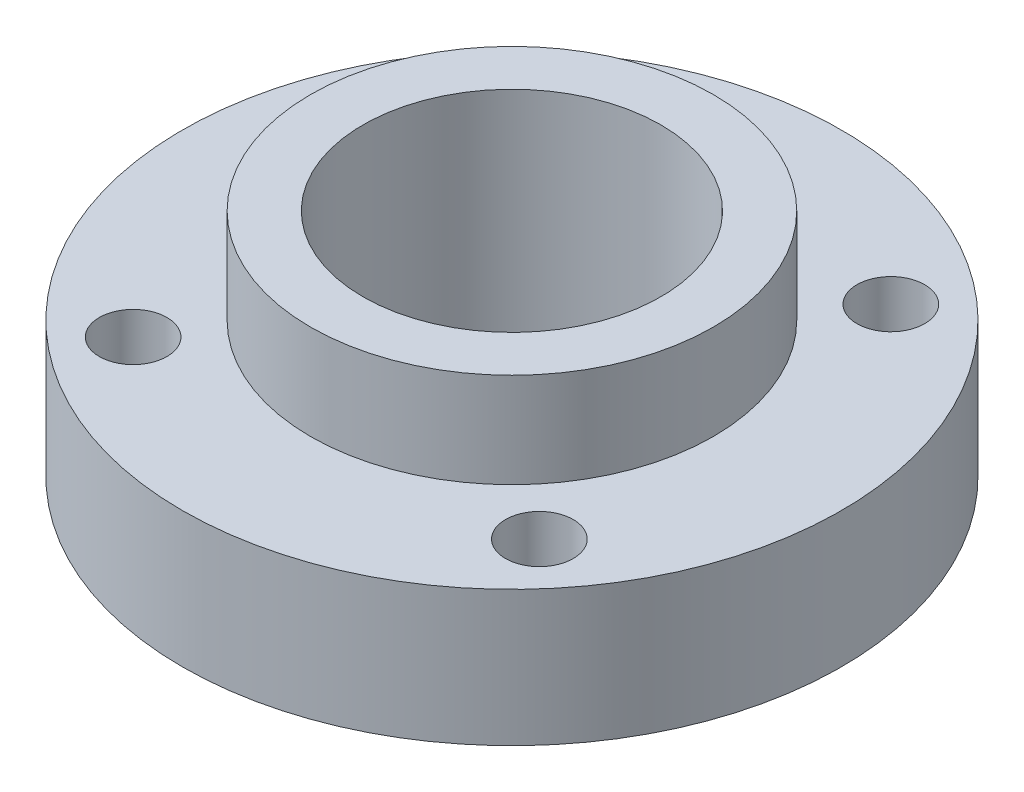
ISO-10303-21;
HEADER;
FILE_DESCRIPTION(('STEP AP214'),'2;1');
FILE_NAME('part.step','',(''),(''),'','','');
FILE_SCHEMA(('AUTOMOTIVE_DESIGN { 1 0 10303 214 1 1 1 1 }'));
ENDSEC;
DATA;
#1=APPLICATION_CONTEXT('core data for automotive mechanical design processes');
#2=APPLICATION_PROTOCOL_DEFINITION('international standard','automotive_design',2000,#1);
#3=PRODUCT_CONTEXT('',#1,'mechanical');
#4=PRODUCT('Part','Part','',(#3));
#5=PRODUCT_RELATED_PRODUCT_CATEGORY('part','',(#4));
#6=PRODUCT_DEFINITION_FORMATION('','',#4);
#7=PRODUCT_DEFINITION_CONTEXT('part definition',#1,'design');
#8=PRODUCT_DEFINITION('design','',#6,#7);
#9=PRODUCT_DEFINITION_SHAPE('','',#8);
#10=(LENGTH_UNIT() NAMED_UNIT(*) SI_UNIT(.MILLI.,.METRE.));
#11=(NAMED_UNIT(*) PLANE_ANGLE_UNIT() SI_UNIT($,.RADIAN.));
#12=(NAMED_UNIT(*) SI_UNIT($,.STERADIAN.) SOLID_ANGLE_UNIT());
#13=UNCERTAINTY_MEASURE_WITH_UNIT(LENGTH_MEASURE(1.E-05),#10,'distance_accuracy_value','');
#14=(GEOMETRIC_REPRESENTATION_CONTEXT(3) GLOBAL_UNCERTAINTY_ASSIGNED_CONTEXT((#13)) GLOBAL_UNIT_ASSIGNED_CONTEXT((#10,
#11,#12)) REPRESENTATION_CONTEXT('',''));
#15=CARTESIAN_POINT('',(0.,0.,0.));
#16=DIRECTION('',(0.,0.,1.));
#17=DIRECTION('',(1.,0.,0.));
#18=AXIS2_PLACEMENT_3D('',#15,#16,#17);
#19=CARTESIAN_POINT('',(-14.907558872272,17.,-21.3800407627514));
#20=DIRECTION('',(0.,-1.,0.));
#21=DIRECTION('',(0.,0.,-1.));
#22=AXIS2_PLACEMENT_3D('',#19,#20,#21);
#23=CYLINDRICAL_SURFACE('',#22,11.);
#24=CARTESIAN_POINT('',(-14.907558872272,1.,-21.3800407627514));
#25=DIRECTION('',(0.,1.,0.));
#26=DIRECTION('',(0.,0.,1.));
#27=AXIS2_PLACEMENT_3D('',#24,#25,#26);
#28=CIRCLE('',#27,11.);
#29=CARTESIAN_POINT('',(-14.907558872272,1.,-10.3800407627514));
#30=VERTEX_POINT('',#29);
#31=EDGE_CURVE('E10',#30,#30,#28,.T.);
#32=ORIENTED_EDGE('',*,*,#31,.F.);
#33=EDGE_LOOP('',(#32));
#34=FACE_BOUND('',#33,.T.);
#35=CARTESIAN_POINT('',(-14.907558872272,17.,-21.3800407627514));
#36=DIRECTION('',(0.,1.,0.));
#37=DIRECTION('',(0.,0.,1.));
#38=AXIS2_PLACEMENT_3D('',#35,#36,#37);
#39=CIRCLE('',#38,11.);
#40=CARTESIAN_POINT('',(-14.907558872272,17.,-10.3800407627514));
#41=VERTEX_POINT('',#40);
#42=EDGE_CURVE('E57',#41,#41,#39,.T.);
#43=ORIENTED_EDGE('',*,*,#42,.T.);
#44=EDGE_LOOP('',(#43));
#45=FACE_BOUND('',#44,.T.);
#46=ADVANCED_FACE('F45',(#34,#45),#23,.F.);
#47=CARTESIAN_POINT('',(-14.907558872272,17.,-21.3800407627514));
#48=DIRECTION('',(0.,-1.,0.));
#49=DIRECTION('',(0.,0.,-1.));
#50=AXIS2_PLACEMENT_3D('',#47,#48,#49);
#51=CYLINDRICAL_SURFACE('',#50,14.875);
#52=CARTESIAN_POINT('',(-14.907558872272,10.,-21.3800407627514));
#53=DIRECTION('',(0.,1.,0.));
#54=DIRECTION('',(0.,0.,1.));
#55=AXIS2_PLACEMENT_3D('',#52,#53,#54);
#56=CIRCLE('',#55,14.875);
#57=CARTESIAN_POINT('',(-14.907558872272,10.,-6.50504076275143));
#58=VERTEX_POINT('',#57);
#59=EDGE_CURVE('E69',#58,#58,#56,.T.);
#60=ORIENTED_EDGE('',*,*,#59,.T.);
#61=EDGE_LOOP('',(#60));
#62=FACE_BOUND('',#61,.T.);
#63=CARTESIAN_POINT('',(-14.907558872272,17.,-21.3800407627514));
#64=DIRECTION('',(0.,1.,0.));
#65=DIRECTION('',(0.,0.,1.));
#66=AXIS2_PLACEMENT_3D('',#63,#64,#65);
#67=CIRCLE('',#66,14.875);
#68=CARTESIAN_POINT('',(-14.907558872272,17.,-6.50504076275143));
#69=VERTEX_POINT('',#68);
#70=EDGE_CURVE('E52',#69,#69,#67,.T.);
#71=ORIENTED_EDGE('',*,*,#70,.F.);
#72=EDGE_LOOP('',(#71));
#73=FACE_BOUND('',#72,.T.);
#74=ADVANCED_FACE('F129',(#62,#73),#51,.T.);
#75=CARTESIAN_POINT('',(0.,17.,0.));
#76=DIRECTION('',(0.,1.,0.));
#77=DIRECTION('',(0.,0.,1.));
#78=AXIS2_PLACEMENT_3D('',#75,#76,#77);
#79=PLANE('',#78);
#80=ORIENTED_EDGE('',*,*,#42,.F.);
#81=EDGE_LOOP('',(#80));
#82=FACE_BOUND('',#81,.T.);
#83=ORIENTED_EDGE('',*,*,#70,.T.);
#84=EDGE_LOOP('',(#83));
#85=FACE_BOUND('',#84,.T.);
#86=ADVANCED_FACE('F134',(#82,#85),#79,.T.);
#87=CARTESIAN_POINT('',(0.,0.,0.));
#88=DIRECTION('',(0.,1.,0.));
#89=DIRECTION('',(0.,0.,1.));
#90=AXIS2_PLACEMENT_3D('',#87,#88,#89);
#91=PLANE('',#90);
#92=CARTESIAN_POINT('',(0.0980108130638321,0.,-8.40088522710385));
#93=DIRECTION('',(0.,1.,0.));
#94=DIRECTION('',(0.,0.,1.));
#95=AXIS2_PLACEMENT_3D('',#92,#93,#94);
#96=CIRCLE('',#95,2.5);
#97=CARTESIAN_POINT('',(0.0980108130638321,0.,-5.90088522710385));
#98=VERTEX_POINT('',#97);
#99=EDGE_CURVE('E82',#98,#98,#96,.T.);
#100=ORIENTED_EDGE('',*,*,#99,.T.);
#101=EDGE_LOOP('',(#100));
#102=FACE_BOUND('',#101,.T.);
#103=CARTESIAN_POINT('',(-1.94608397248787,0.,-36.4008852271039));
#104=DIRECTION('',(0.,1.,0.));
#105=DIRECTION('',(0.,0.,1.));
#106=AXIS2_PLACEMENT_3D('',#103,#104,#105);
#107=CIRCLE('',#106,2.5);
#108=CARTESIAN_POINT('',(-1.94608397248787,0.,-33.9008852271039));
#109=VERTEX_POINT('',#108);
#110=EDGE_CURVE('E78',#109,#109,#107,.T.);
#111=ORIENTED_EDGE('',*,*,#110,.T.);
#112=EDGE_LOOP('',(#111));
#113=FACE_BOUND('',#112,.T.);
#114=CARTESIAN_POINT('',(-27.8246335332248,0.,-6.32099755930153));
#115=DIRECTION('',(0.,1.,0.));
#116=DIRECTION('',(0.,0.,1.));
#117=AXIS2_PLACEMENT_3D('',#114,#115,#116);
#118=CIRCLE('',#117,2.49999999999999);
#119=CARTESIAN_POINT('',(-27.8246335332248,0.,-3.82099755930154));
#120=VERTEX_POINT('',#119);
#121=EDGE_CURVE('E74',#120,#120,#118,.T.);
#122=ORIENTED_EDGE('',*,*,#121,.T.);
#123=EDGE_LOOP('',(#122));
#124=FACE_BOUND('',#123,.T.);
#125=CARTESIAN_POINT('',(-29.9460839724879,0.,-34.3209975593015));
#126=DIRECTION('',(0.,1.,0.));
#127=DIRECTION('',(0.,0.,1.));
#128=AXIS2_PLACEMENT_3D('',#125,#126,#127);
#129=CIRCLE('',#128,2.5);
#130=CARTESIAN_POINT('',(-29.9460839724879,0.,-31.8209975593015));
#131=VERTEX_POINT('',#130);
#132=EDGE_CURVE('E70',#131,#131,#129,.T.);
#133=ORIENTED_EDGE('',*,*,#132,.T.);
#134=EDGE_LOOP('',(#133));
#135=FACE_BOUND('',#134,.T.);
#136=CARTESIAN_POINT('',(-14.907558872272,0.,-21.3800407627514));
#137=DIRECTION('',(0.,1.,0.));
#138=DIRECTION('',(0.,0.,1.));
#139=AXIS2_PLACEMENT_3D('',#136,#137,#138);
#140=CIRCLE('',#139,24.34);
#141=CARTESIAN_POINT('',(-14.907558872272,0.,2.95995923724857));
#142=VERTEX_POINT('',#141);
#143=EDGE_CURVE('E65',#142,#142,#140,.T.);
#144=ORIENTED_EDGE('',*,*,#143,.F.);
#145=EDGE_LOOP('',(#144));
#146=FACE_BOUND('',#145,.T.);
#147=CARTESIAN_POINT('',(-14.907558872272,0.,-21.3800407627514));
#148=DIRECTION('',(0.,1.,0.));
#149=DIRECTION('',(0.,0.,1.));
#150=AXIS2_PLACEMENT_3D('',#147,#148,#149);
#151=CIRCLE('',#150,7.375);
#152=CARTESIAN_POINT('',(-14.907558872272,0.,-14.0050407627514));
#153=VERTEX_POINT('',#152);
#154=EDGE_CURVE('E109',#153,#153,#151,.T.);
#155=ORIENTED_EDGE('',*,*,#154,.T.);
#156=EDGE_LOOP('',(#155));
#157=FACE_BOUND('',#156,.T.);
#158=ADVANCED_FACE('F140',(#102,#113,#124,#135,#146,#157),#91,.F.);
#159=CARTESIAN_POINT('',(-29.9460839724879,10.,-34.3209975593015));
#160=DIRECTION('',(0.,-1.,0.));
#161=DIRECTION('',(0.,0.,-1.));
#162=AXIS2_PLACEMENT_3D('',#159,#160,#161);
#163=CYLINDRICAL_SURFACE('',#162,2.5);
#164=CARTESIAN_POINT('',(-29.9460839724879,10.,-34.3209975593015));
#165=DIRECTION('',(0.,1.,0.));
#166=DIRECTION('',(0.,0.,1.));
#167=AXIS2_PLACEMENT_3D('',#164,#165,#166);
#168=CIRCLE('',#167,2.5);
#169=CARTESIAN_POINT('',(-29.9460839724879,10.,-31.8209975593015));
#170=VERTEX_POINT('',#169);
#171=EDGE_CURVE('E90',#170,#170,#168,.T.);
#172=ORIENTED_EDGE('',*,*,#171,.T.);
#173=EDGE_LOOP('',(#172));
#174=FACE_BOUND('',#173,.T.);
#175=ORIENTED_EDGE('',*,*,#132,.F.);
#176=EDGE_LOOP('',(#175));
#177=FACE_BOUND('',#176,.T.);
#178=ADVANCED_FACE('F145',(#174,#177),#163,.F.);
#179=CARTESIAN_POINT('',(-27.8246335332248,10.,-6.32099755930153));
#180=DIRECTION('',(0.,-1.,0.));
#181=DIRECTION('',(0.,0.,-1.));
#182=AXIS2_PLACEMENT_3D('',#179,#180,#181);
#183=CYLINDRICAL_SURFACE('',#182,2.49999999999999);
#184=CARTESIAN_POINT('',(-27.8246335332248,10.,-6.32099755930153));
#185=DIRECTION('',(0.,1.,0.));
#186=DIRECTION('',(0.,0.,1.));
#187=AXIS2_PLACEMENT_3D('',#184,#185,#186);
#188=CIRCLE('',#187,2.49999999999999);
#189=CARTESIAN_POINT('',(-27.8246335332248,10.,-3.82099755930154));
#190=VERTEX_POINT('',#189);
#191=EDGE_CURVE('E94',#190,#190,#188,.T.);
#192=ORIENTED_EDGE('',*,*,#191,.T.);
#193=EDGE_LOOP('',(#192));
#194=FACE_BOUND('',#193,.T.);
#195=ORIENTED_EDGE('',*,*,#121,.F.);
#196=EDGE_LOOP('',(#195));
#197=FACE_BOUND('',#196,.T.);
#198=ADVANCED_FACE('F157',(#194,#197),#183,.F.);
#199=CARTESIAN_POINT('',(-1.94608397248787,10.,-36.4008852271039));
#200=DIRECTION('',(0.,-1.,0.));
#201=DIRECTION('',(0.,0.,-1.));
#202=AXIS2_PLACEMENT_3D('',#199,#200,#201);
#203=CYLINDRICAL_SURFACE('',#202,2.5);
#204=CARTESIAN_POINT('',(-1.94608397248787,10.,-36.4008852271039));
#205=DIRECTION('',(0.,1.,0.));
#206=DIRECTION('',(0.,0.,1.));
#207=AXIS2_PLACEMENT_3D('',#204,#205,#206);
#208=CIRCLE('',#207,2.5);
#209=CARTESIAN_POINT('',(-1.94608397248787,10.,-33.9008852271039));
#210=VERTEX_POINT('',#209);
#211=EDGE_CURVE('E98',#210,#210,#208,.T.);
#212=ORIENTED_EDGE('',*,*,#211,.T.);
#213=EDGE_LOOP('',(#212));
#214=FACE_BOUND('',#213,.T.);
#215=ORIENTED_EDGE('',*,*,#110,.F.);
#216=EDGE_LOOP('',(#215));
#217=FACE_BOUND('',#216,.T.);
#218=ADVANCED_FACE('F153',(#214,#217),#203,.F.);
#219=CARTESIAN_POINT('',(0.0980108130638321,10.,-8.40088522710385));
#220=DIRECTION('',(0.,-1.,0.));
#221=DIRECTION('',(0.,0.,-1.));
#222=AXIS2_PLACEMENT_3D('',#219,#220,#221);
#223=CYLINDRICAL_SURFACE('',#222,2.5);
#224=CARTESIAN_POINT('',(0.0980108130638321,10.,-8.40088522710385));
#225=DIRECTION('',(0.,1.,0.));
#226=DIRECTION('',(0.,0.,1.));
#227=AXIS2_PLACEMENT_3D('',#224,#225,#226);
#228=CIRCLE('',#227,2.5);
#229=CARTESIAN_POINT('',(0.0980108130638321,10.,-5.90088522710385));
#230=VERTEX_POINT('',#229);
#231=EDGE_CURVE('E102',#230,#230,#228,.T.);
#232=ORIENTED_EDGE('',*,*,#231,.T.);
#233=EDGE_LOOP('',(#232));
#234=FACE_BOUND('',#233,.T.);
#235=ORIENTED_EDGE('',*,*,#99,.F.);
#236=EDGE_LOOP('',(#235));
#237=FACE_BOUND('',#236,.T.);
#238=ADVANCED_FACE('F149',(#234,#237),#223,.F.);
#239=CARTESIAN_POINT('',(-14.907558872272,10.,-21.3800407627514));
#240=DIRECTION('',(0.,-1.,0.));
#241=DIRECTION('',(0.,0.,-1.));
#242=AXIS2_PLACEMENT_3D('',#239,#240,#241);
#243=CYLINDRICAL_SURFACE('',#242,24.34);
#244=CARTESIAN_POINT('',(-14.907558872272,10.,-21.3800407627514));
#245=DIRECTION('',(0.,1.,0.));
#246=DIRECTION('',(0.,0.,1.));
#247=AXIS2_PLACEMENT_3D('',#244,#245,#246);
#248=CIRCLE('',#247,24.34);
#249=CARTESIAN_POINT('',(-14.907558872272,10.,2.95995923724857));
#250=VERTEX_POINT('',#249);
#251=EDGE_CURVE('E62',#250,#250,#248,.T.);
#252=ORIENTED_EDGE('',*,*,#251,.F.);
#253=EDGE_LOOP('',(#252));
#254=FACE_BOUND('',#253,.T.);
#255=ORIENTED_EDGE('',*,*,#143,.T.);
#256=EDGE_LOOP('',(#255));
#257=FACE_BOUND('',#256,.T.);
#258=ADVANCED_FACE('F152',(#254,#257),#243,.T.);
#259=CARTESIAN_POINT('',(0.,10.,0.));
#260=DIRECTION('',(0.,1.,0.));
#261=DIRECTION('',(0.,0.,1.));
#262=AXIS2_PLACEMENT_3D('',#259,#260,#261);
#263=PLANE('',#262);
#264=ORIENTED_EDGE('',*,*,#59,.F.);
#265=EDGE_LOOP('',(#264));
#266=FACE_BOUND('',#265,.T.);
#267=ORIENTED_EDGE('',*,*,#231,.F.);
#268=EDGE_LOOP('',(#267));
#269=FACE_BOUND('',#268,.T.);
#270=ORIENTED_EDGE('',*,*,#211,.F.);
#271=EDGE_LOOP('',(#270));
#272=FACE_BOUND('',#271,.T.);
#273=ORIENTED_EDGE('',*,*,#191,.F.);
#274=EDGE_LOOP('',(#273));
#275=FACE_BOUND('',#274,.T.);
#276=ORIENTED_EDGE('',*,*,#171,.F.);
#277=EDGE_LOOP('',(#276));
#278=FACE_BOUND('',#277,.T.);
#279=ORIENTED_EDGE('',*,*,#251,.T.);
#280=EDGE_LOOP('',(#279));
#281=FACE_BOUND('',#280,.T.);
#282=ADVANCED_FACE('F126',(#266,#269,#272,#275,#278,#281),#263,.T.);
#283=CARTESIAN_POINT('',(-14.907558872272,1.,-21.3800407627514));
#284=DIRECTION('',(0.,-1.,0.));
#285=DIRECTION('',(0.,0.,-1.));
#286=AXIS2_PLACEMENT_3D('',#283,#284,#285);
#287=CYLINDRICAL_SURFACE('',#286,7.375);
#288=CARTESIAN_POINT('',(-14.907558872272,1.,-21.3800407627514));
#289=DIRECTION('',(0.,1.,0.));
#290=DIRECTION('',(0.,0.,1.));
#291=AXIS2_PLACEMENT_3D('',#288,#289,#290);
#292=CIRCLE('',#291,7.375);
#293=CARTESIAN_POINT('',(-14.907558872272,1.,-14.0050407627514));
#294=VERTEX_POINT('',#293);
#295=EDGE_CURVE('E86',#294,#294,#292,.T.);
#296=ORIENTED_EDGE('',*,*,#295,.T.);
#297=EDGE_LOOP('',(#296));
#298=FACE_BOUND('',#297,.T.);
#299=ORIENTED_EDGE('',*,*,#154,.F.);
#300=EDGE_LOOP('',(#299));
#301=FACE_BOUND('',#300,.T.);
#302=ADVANCED_FACE('F117',(#298,#301),#287,.F.);
#303=CARTESIAN_POINT('',(0.,1.,0.));
#304=DIRECTION('',(0.,1.,0.));
#305=DIRECTION('',(0.,0.,1.));
#306=AXIS2_PLACEMENT_3D('',#303,#304,#305);
#307=PLANE('',#306);
#308=ORIENTED_EDGE('',*,*,#295,.F.);
#309=EDGE_LOOP('',(#308));
#310=FACE_BOUND('',#309,.T.);
#311=ORIENTED_EDGE('',*,*,#31,.T.);
#312=EDGE_LOOP('',(#311));
#313=FACE_BOUND('',#312,.T.);
#314=ADVANCED_FACE('F120',(#310,#313),#307,.T.);
#315=CLOSED_SHELL('',(#46,#74,#86,#158,#178,#198,#218,#238,#258,#282,#302,#314));
#316=MANIFOLD_SOLID_BREP('B2',#315);
#317=ADVANCED_BREP_SHAPE_REPRESENTATION('',(#18,#316),#14);
#318=SHAPE_DEFINITION_REPRESENTATION(#9,#317);
ENDSEC;
END-ISO-10303-21;
